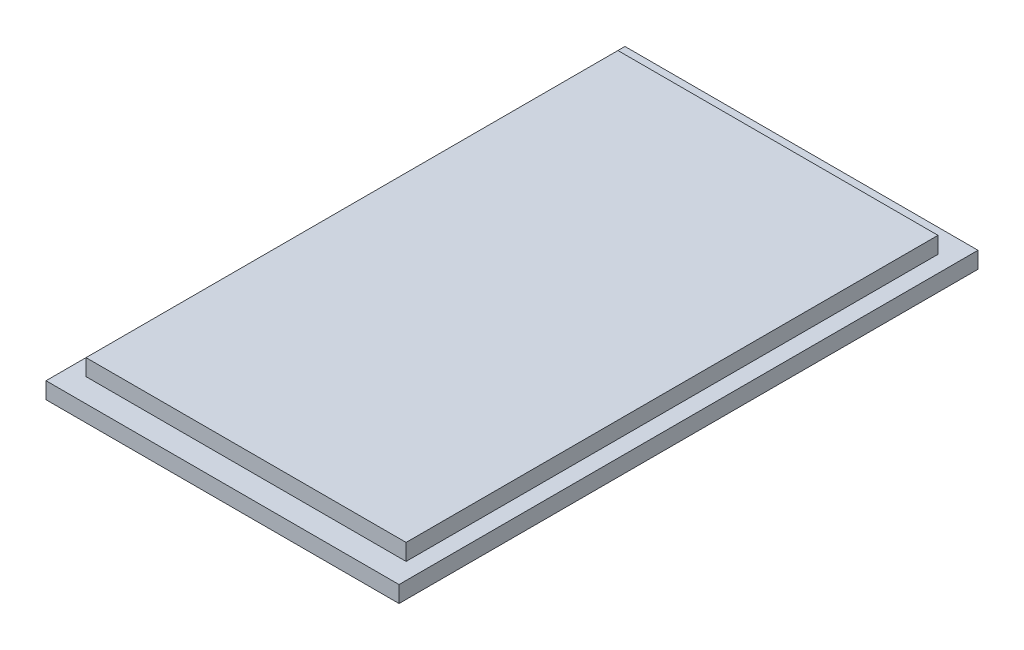
ISO-10303-21;
HEADER;
FILE_DESCRIPTION(('STEP AP214'),'2;1');
FILE_NAME('part.step','',(''),(''),'','','');
FILE_SCHEMA(('AUTOMOTIVE_DESIGN { 1 0 10303 214 1 1 1 1 }'));
ENDSEC;
DATA;
#1=APPLICATION_CONTEXT('core data for automotive mechanical design processes');
#2=APPLICATION_PROTOCOL_DEFINITION('international standard','automotive_design',2000,#1);
#3=PRODUCT_CONTEXT('',#1,'mechanical');
#4=PRODUCT('Part','Part','',(#3));
#5=PRODUCT_RELATED_PRODUCT_CATEGORY('part','',(#4));
#6=PRODUCT_DEFINITION_FORMATION('','',#4);
#7=PRODUCT_DEFINITION_CONTEXT('part definition',#1,'design');
#8=PRODUCT_DEFINITION('design','',#6,#7);
#9=PRODUCT_DEFINITION_SHAPE('','',#8);
#10=(LENGTH_UNIT() NAMED_UNIT(*) SI_UNIT(.MILLI.,.METRE.));
#11=(NAMED_UNIT(*) PLANE_ANGLE_UNIT() SI_UNIT($,.RADIAN.));
#12=(NAMED_UNIT(*) SI_UNIT($,.STERADIAN.) SOLID_ANGLE_UNIT());
#13=UNCERTAINTY_MEASURE_WITH_UNIT(LENGTH_MEASURE(1.E-05),#10,'distance_accuracy_value','');
#14=(GEOMETRIC_REPRESENTATION_CONTEXT(3) GLOBAL_UNCERTAINTY_ASSIGNED_CONTEXT((#13)) GLOBAL_UNIT_ASSIGNED_CONTEXT((#10,
#11,#12)) REPRESENTATION_CONTEXT('',''));
#15=CARTESIAN_POINT('',(0.,0.,0.));
#16=DIRECTION('',(0.,0.,1.));
#17=DIRECTION('',(1.,0.,0.));
#18=AXIS2_PLACEMENT_3D('',#15,#16,#17);
#19=CARTESIAN_POINT('',(0.,1.75,0.));
#20=DIRECTION('',(0.,-1.,0.));
#21=DIRECTION('',(0.,0.,-1.));
#22=AXIS2_PLACEMENT_3D('',#19,#20,#21);
#23=PLANE('',#22);
#24=DIRECTION('',(0.,0.,1.));
#25=VECTOR('',#24,1.);
#26=CARTESIAN_POINT('',(-175.642564618805,1.75,124.068616843366));
#27=LINE('',#26,#25);
#28=CARTESIAN_POINT('',(-175.642564618805,1.75,62.5686168433657));
#29=VERTEX_POINT('',#28);
#30=CARTESIAN_POINT('',(-175.642564618805,1.75,124.068616843366));
#31=VERTEX_POINT('',#30);
#32=EDGE_CURVE('E129',#29,#31,#27,.T.);
#33=ORIENTED_EDGE('',*,*,#32,.T.);
#34=DIRECTION('',(1.,0.,0.));
#35=VECTOR('',#34,1.);
#36=CARTESIAN_POINT('',(-175.642564618805,1.75,124.068616843366));
#37=LINE('',#36,#35);
#38=CARTESIAN_POINT('',(-138.142564618805,1.75,124.068616843366));
#39=VERTEX_POINT('',#38);
#40=EDGE_CURVE('E132',#31,#39,#37,.T.);
#41=ORIENTED_EDGE('',*,*,#40,.T.);
#42=DIRECTION('',(0.,0.,-1.));
#43=VECTOR('',#42,1.);
#44=CARTESIAN_POINT('',(-138.142564618805,1.75,124.068616843366));
#45=LINE('',#44,#43);
#46=CARTESIAN_POINT('',(-138.142564618805,1.75,62.5686168433657));
#47=VERTEX_POINT('',#46);
#48=EDGE_CURVE('E135',#39,#47,#45,.T.);
#49=ORIENTED_EDGE('',*,*,#48,.T.);
#50=DIRECTION('',(-1.,0.,0.));
#51=VECTOR('',#50,1.);
#52=CARTESIAN_POINT('',(-175.642564618805,1.75,62.5686168433657));
#53=LINE('',#52,#51);
#54=EDGE_CURVE('E137',#47,#29,#53,.T.);
#55=ORIENTED_EDGE('',*,*,#54,.T.);
#56=EDGE_LOOP('',(#33,#41,#49,#55));
#57=FACE_BOUND('',#56,.T.);
#58=DIRECTION('',(0.,0.,1.));
#59=VECTOR('',#58,1.);
#60=CARTESIAN_POINT('',(-173.892564618805,1.75,121.568616843366));
#61=LINE('',#60,#59);
#62=CARTESIAN_POINT('',(-173.892564618805,1.75,65.0686168433657));
#63=VERTEX_POINT('',#62);
#64=CARTESIAN_POINT('',(-173.892564618805,1.75,121.568616843366));
#65=VERTEX_POINT('',#64);
#66=EDGE_CURVE('E50',#63,#65,#61,.T.);
#67=ORIENTED_EDGE('',*,*,#66,.F.);
#68=DIRECTION('',(-1.,0.,0.));
#69=VECTOR('',#68,1.);
#70=CARTESIAN_POINT('',(-173.892564618805,1.75,65.0686168433657));
#71=LINE('',#70,#69);
#72=CARTESIAN_POINT('',(-139.892564618805,1.75,65.0686168433657));
#73=VERTEX_POINT('',#72);
#74=EDGE_CURVE('E54',#73,#63,#71,.T.);
#75=ORIENTED_EDGE('',*,*,#74,.F.);
#76=DIRECTION('',(0.,0.,-1.));
#77=VECTOR('',#76,1.);
#78=CARTESIAN_POINT('',(-139.892564618805,1.75,121.568616843366));
#79=LINE('',#78,#77);
#80=CARTESIAN_POINT('',(-139.892564618805,1.75,121.568616843366));
#81=VERTEX_POINT('',#80);
#82=EDGE_CURVE('E262',#81,#73,#79,.T.);
#83=ORIENTED_EDGE('',*,*,#82,.F.);
#84=DIRECTION('',(1.,0.,0.));
#85=VECTOR('',#84,1.);
#86=CARTESIAN_POINT('',(-173.892564618805,1.75,121.568616843366));
#87=LINE('',#86,#85);
#88=EDGE_CURVE('E268',#65,#81,#87,.T.);
#89=ORIENTED_EDGE('',*,*,#88,.F.);
#90=EDGE_LOOP('',(#67,#75,#83,#89));
#91=FACE_BOUND('',#90,.T.);
#92=ADVANCED_FACE('F35',(#57,#91),#23,.F.);
#93=CARTESIAN_POINT('',(-175.642564618805,1.75,124.068616843366));
#94=DIRECTION('',(1.,0.,0.));
#95=DIRECTION('',(0.,0.,-1.));
#96=AXIS2_PLACEMENT_3D('',#93,#94,#95);
#97=PLANE('',#96);
#98=DIRECTION('',(0.,0.,1.));
#99=VECTOR('',#98,1.);
#100=CARTESIAN_POINT('',(-175.642564618805,0.,124.068616843366));
#101=LINE('',#100,#99);
#102=CARTESIAN_POINT('',(-175.642564618805,0.,62.5686168433657));
#103=VERTEX_POINT('',#102);
#104=CARTESIAN_POINT('',(-175.642564618805,0.,124.068616843366));
#105=VERTEX_POINT('',#104);
#106=EDGE_CURVE('E120',#103,#105,#101,.T.);
#107=ORIENTED_EDGE('',*,*,#106,.T.);
#108=DIRECTION('',(0.,-1.,0.));
#109=VECTOR('',#108,1.);
#110=CARTESIAN_POINT('',(-175.642564618805,1.75,124.068616843366));
#111=LINE('',#110,#109);
#112=EDGE_CURVE('E11',#31,#105,#111,.T.);
#113=ORIENTED_EDGE('',*,*,#112,.F.);
#114=ORIENTED_EDGE('',*,*,#32,.F.);
#115=DIRECTION('',(0.,-1.,0.));
#116=VECTOR('',#115,1.);
#117=CARTESIAN_POINT('',(-175.642564618805,1.75,62.5686168433657));
#118=LINE('',#117,#116);
#119=EDGE_CURVE('E138',#29,#103,#118,.T.);
#120=ORIENTED_EDGE('',*,*,#119,.T.);
#121=EDGE_LOOP('',(#107,#113,#114,#120));
#122=FACE_BOUND('',#121,.T.);
#123=ADVANCED_FACE('F37',(#122),#97,.F.);
#124=CARTESIAN_POINT('',(-175.642564618805,1.75,124.068616843366));
#125=DIRECTION('',(0.,0.,-1.));
#126=DIRECTION('',(-1.,0.,0.));
#127=AXIS2_PLACEMENT_3D('',#124,#125,#126);
#128=PLANE('',#127);
#129=DIRECTION('',(1.,0.,0.));
#130=VECTOR('',#129,1.);
#131=CARTESIAN_POINT('',(-175.642564618805,0.,124.068616843366));
#132=LINE('',#131,#130);
#133=CARTESIAN_POINT('',(-138.142564618805,0.,124.068616843366));
#134=VERTEX_POINT('',#133);
#135=EDGE_CURVE('E123',#105,#134,#132,.T.);
#136=ORIENTED_EDGE('',*,*,#135,.T.);
#137=DIRECTION('',(0.,-1.,0.));
#138=VECTOR('',#137,1.);
#139=CARTESIAN_POINT('',(-138.142564618805,1.75,124.068616843366));
#140=LINE('',#139,#138);
#141=EDGE_CURVE('E43',#39,#134,#140,.T.);
#142=ORIENTED_EDGE('',*,*,#141,.F.);
#143=ORIENTED_EDGE('',*,*,#40,.F.);
#144=ORIENTED_EDGE('',*,*,#112,.T.);
#145=EDGE_LOOP('',(#136,#142,#143,#144));
#146=FACE_BOUND('',#145,.T.);
#147=ADVANCED_FACE('F168',(#146),#128,.F.);
#148=CARTESIAN_POINT('',(-138.142564618805,1.75,124.068616843366));
#149=DIRECTION('',(-1.,0.,0.));
#150=DIRECTION('',(0.,0.,1.));
#151=AXIS2_PLACEMENT_3D('',#148,#149,#150);
#152=PLANE('',#151);
#153=DIRECTION('',(0.,0.,-1.));
#154=VECTOR('',#153,1.);
#155=CARTESIAN_POINT('',(-138.142564618805,0.,124.068616843366));
#156=LINE('',#155,#154);
#157=CARTESIAN_POINT('',(-138.142564618805,0.,62.5686168433657));
#158=VERTEX_POINT('',#157);
#159=EDGE_CURVE('E141',#134,#158,#156,.T.);
#160=ORIENTED_EDGE('',*,*,#159,.T.);
#161=DIRECTION('',(0.,-1.,0.));
#162=VECTOR('',#161,1.);
#163=CARTESIAN_POINT('',(-138.142564618805,1.75,62.5686168433657));
#164=LINE('',#163,#162);
#165=EDGE_CURVE('E146',#47,#158,#164,.T.);
#166=ORIENTED_EDGE('',*,*,#165,.F.);
#167=ORIENTED_EDGE('',*,*,#48,.F.);
#168=ORIENTED_EDGE('',*,*,#141,.T.);
#169=EDGE_LOOP('',(#160,#166,#167,#168));
#170=FACE_BOUND('',#169,.T.);
#171=ADVANCED_FACE('F153',(#170),#152,.F.);
#172=CARTESIAN_POINT('',(-175.642564618805,1.75,62.5686168433657));
#173=DIRECTION('',(0.,0.,1.));
#174=DIRECTION('',(1.,0.,0.));
#175=AXIS2_PLACEMENT_3D('',#172,#173,#174);
#176=PLANE('',#175);
#177=DIRECTION('',(-1.,0.,0.));
#178=VECTOR('',#177,1.);
#179=CARTESIAN_POINT('',(-175.642564618805,0.,62.5686168433657));
#180=LINE('',#179,#178);
#181=EDGE_CURVE('E133',#158,#103,#180,.T.);
#182=ORIENTED_EDGE('',*,*,#181,.T.);
#183=ORIENTED_EDGE('',*,*,#119,.F.);
#184=ORIENTED_EDGE('',*,*,#54,.F.);
#185=ORIENTED_EDGE('',*,*,#165,.T.);
#186=EDGE_LOOP('',(#182,#183,#184,#185));
#187=FACE_BOUND('',#186,.T.);
#188=ADVANCED_FACE('F162',(#187),#176,.F.);
#189=CARTESIAN_POINT('',(0.,0.,0.));
#190=DIRECTION('',(0.,-1.,0.));
#191=DIRECTION('',(0.,0.,-1.));
#192=AXIS2_PLACEMENT_3D('',#189,#190,#191);
#193=PLANE('',#192);
#194=ORIENTED_EDGE('',*,*,#106,.F.);
#195=ORIENTED_EDGE('',*,*,#181,.F.);
#196=ORIENTED_EDGE('',*,*,#159,.F.);
#197=ORIENTED_EDGE('',*,*,#135,.F.);
#198=EDGE_LOOP('',(#194,#195,#196,#197));
#199=FACE_BOUND('',#198,.T.);
#200=ADVANCED_FACE('F159',(#199),#193,.T.);
#201=CARTESIAN_POINT('',(-173.892564618805,3.5,121.568616843366));
#202=DIRECTION('',(1.,0.,0.));
#203=DIRECTION('',(0.,0.,-1.));
#204=AXIS2_PLACEMENT_3D('',#201,#202,#203);
#205=PLANE('',#204);
#206=ORIENTED_EDGE('',*,*,#66,.T.);
#207=DIRECTION('',(0.,-1.,0.));
#208=VECTOR('',#207,1.);
#209=CARTESIAN_POINT('',(-173.892564618805,3.5,121.568616843366));
#210=LINE('',#209,#208);
#211=CARTESIAN_POINT('',(-173.892564618805,3.5,121.568616843366));
#212=VERTEX_POINT('',#211);
#213=EDGE_CURVE('E103',#212,#65,#210,.T.);
#214=ORIENTED_EDGE('',*,*,#213,.F.);
#215=DIRECTION('',(0.,0.,1.));
#216=VECTOR('',#215,1.);
#217=CARTESIAN_POINT('',(-173.892564618805,3.5,121.568616843366));
#218=LINE('',#217,#216);
#219=CARTESIAN_POINT('',(-173.892564618805,3.5,65.0686168433657));
#220=VERTEX_POINT('',#219);
#221=EDGE_CURVE('E109',#220,#212,#218,.T.);
#222=ORIENTED_EDGE('',*,*,#221,.F.);
#223=DIRECTION('',(0.,-1.,0.));
#224=VECTOR('',#223,1.);
#225=CARTESIAN_POINT('',(-173.892564618805,3.5,65.0686168433657));
#226=LINE('',#225,#224);
#227=EDGE_CURVE('E260',#220,#63,#226,.T.);
#228=ORIENTED_EDGE('',*,*,#227,.T.);
#229=EDGE_LOOP('',(#206,#214,#222,#228));
#230=FACE_BOUND('',#229,.T.);
#231=ADVANCED_FACE('F119',(#230),#205,.F.);
#232=CARTESIAN_POINT('',(-173.892564618805,3.5,121.568616843366));
#233=DIRECTION('',(0.,0.,-1.));
#234=DIRECTION('',(-1.,0.,0.));
#235=AXIS2_PLACEMENT_3D('',#232,#233,#234);
#236=PLANE('',#235);
#237=ORIENTED_EDGE('',*,*,#88,.T.);
#238=DIRECTION('',(0.,-1.,0.));
#239=VECTOR('',#238,1.);
#240=CARTESIAN_POINT('',(-139.892564618805,3.5,121.568616843366));
#241=LINE('',#240,#239);
#242=CARTESIAN_POINT('',(-139.892564618805,3.5,121.568616843366));
#243=VERTEX_POINT('',#242);
#244=EDGE_CURVE('E105',#243,#81,#241,.T.);
#245=ORIENTED_EDGE('',*,*,#244,.F.);
#246=DIRECTION('',(1.,0.,0.));
#247=VECTOR('',#246,1.);
#248=CARTESIAN_POINT('',(-173.892564618805,3.5,121.568616843366));
#249=LINE('',#248,#247);
#250=EDGE_CURVE('E98',#212,#243,#249,.T.);
#251=ORIENTED_EDGE('',*,*,#250,.F.);
#252=ORIENTED_EDGE('',*,*,#213,.T.);
#253=EDGE_LOOP('',(#237,#245,#251,#252));
#254=FACE_BOUND('',#253,.T.);
#255=ADVANCED_FACE('F101',(#254),#236,.F.);
#256=CARTESIAN_POINT('',(-139.892564618805,3.5,121.568616843366));
#257=DIRECTION('',(-1.,0.,0.));
#258=DIRECTION('',(0.,0.,1.));
#259=AXIS2_PLACEMENT_3D('',#256,#257,#258);
#260=PLANE('',#259);
#261=ORIENTED_EDGE('',*,*,#82,.T.);
#262=DIRECTION('',(0.,-1.,0.));
#263=VECTOR('',#262,1.);
#264=CARTESIAN_POINT('',(-139.892564618805,3.5,65.0686168433657));
#265=LINE('',#264,#263);
#266=CARTESIAN_POINT('',(-139.892564618805,3.5,65.0686168433657));
#267=VERTEX_POINT('',#266);
#268=EDGE_CURVE('E125',#267,#73,#265,.T.);
#269=ORIENTED_EDGE('',*,*,#268,.F.);
#270=DIRECTION('',(0.,0.,-1.));
#271=VECTOR('',#270,1.);
#272=CARTESIAN_POINT('',(-139.892564618805,3.5,121.568616843366));
#273=LINE('',#272,#271);
#274=EDGE_CURVE('E108',#243,#267,#273,.T.);
#275=ORIENTED_EDGE('',*,*,#274,.F.);
#276=ORIENTED_EDGE('',*,*,#244,.T.);
#277=EDGE_LOOP('',(#261,#269,#275,#276));
#278=FACE_BOUND('',#277,.T.);
#279=ADVANCED_FACE('F204',(#278),#260,.F.);
#280=CARTESIAN_POINT('',(-173.892564618805,3.5,65.0686168433657));
#281=DIRECTION('',(0.,0.,1.));
#282=DIRECTION('',(1.,0.,0.));
#283=AXIS2_PLACEMENT_3D('',#280,#281,#282);
#284=PLANE('',#283);
#285=ORIENTED_EDGE('',*,*,#74,.T.);
#286=ORIENTED_EDGE('',*,*,#227,.F.);
#287=DIRECTION('',(-1.,0.,0.));
#288=VECTOR('',#287,1.);
#289=CARTESIAN_POINT('',(-173.892564618805,3.5,65.0686168433657));
#290=LINE('',#289,#288);
#291=EDGE_CURVE('E114',#267,#220,#290,.T.);
#292=ORIENTED_EDGE('',*,*,#291,.F.);
#293=ORIENTED_EDGE('',*,*,#268,.T.);
#294=EDGE_LOOP('',(#285,#286,#292,#293));
#295=FACE_BOUND('',#294,.T.);
#296=ADVANCED_FACE('F210',(#295),#284,.F.);
#297=CARTESIAN_POINT('',(0.,3.5,0.));
#298=DIRECTION('',(0.,-1.,0.));
#299=DIRECTION('',(0.,0.,-1.));
#300=AXIS2_PLACEMENT_3D('',#297,#298,#299);
#301=PLANE('',#300);
#302=ORIENTED_EDGE('',*,*,#221,.T.);
#303=ORIENTED_EDGE('',*,*,#250,.T.);
#304=ORIENTED_EDGE('',*,*,#274,.T.);
#305=ORIENTED_EDGE('',*,*,#291,.T.);
#306=EDGE_LOOP('',(#302,#303,#304,#305));
#307=FACE_BOUND('',#306,.T.);
#308=ADVANCED_FACE('F112',(#307),#301,.F.);
#309=CLOSED_SHELL('',(#92,#123,#147,#171,#188,#200,#231,#255,#279,#296,#308));
#310=MANIFOLD_SOLID_BREP('B2',#309);
#311=ADVANCED_BREP_SHAPE_REPRESENTATION('',(#18,#310),#14);
#312=SHAPE_DEFINITION_REPRESENTATION(#9,#311);
ENDSEC;
END-ISO-10303-21;
